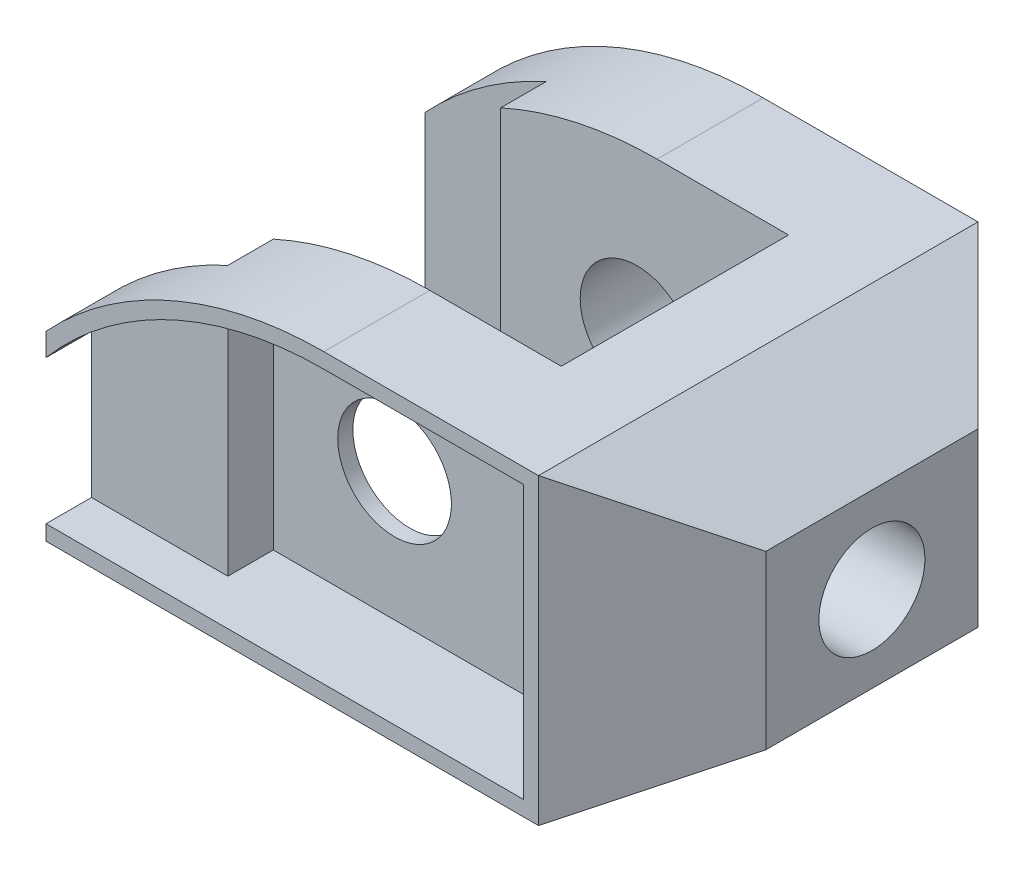
ISO-10303-21;
HEADER;
FILE_DESCRIPTION(('STEP AP214'),'2;1');
FILE_NAME('part.step','',(''),(''),'','','');
FILE_SCHEMA(('AUTOMOTIVE_DESIGN { 1 0 10303 214 1 1 1 1 }'));
ENDSEC;
DATA;
#1=APPLICATION_CONTEXT('core data for automotive mechanical design processes');
#2=APPLICATION_PROTOCOL_DEFINITION('international standard','automotive_design',2000,#1);
#3=PRODUCT_CONTEXT('',#1,'mechanical');
#4=PRODUCT('Part','Part','',(#3));
#5=PRODUCT_RELATED_PRODUCT_CATEGORY('part','',(#4));
#6=PRODUCT_DEFINITION_FORMATION('','',#4);
#7=PRODUCT_DEFINITION_CONTEXT('part definition',#1,'design');
#8=PRODUCT_DEFINITION('design','',#6,#7);
#9=PRODUCT_DEFINITION_SHAPE('','',#8);
#10=(LENGTH_UNIT() NAMED_UNIT(*) SI_UNIT(.MILLI.,.METRE.));
#11=(NAMED_UNIT(*) PLANE_ANGLE_UNIT() SI_UNIT($,.RADIAN.));
#12=(NAMED_UNIT(*) SI_UNIT($,.STERADIAN.) SOLID_ANGLE_UNIT());
#13=UNCERTAINTY_MEASURE_WITH_UNIT(LENGTH_MEASURE(1.E-05),#10,'distance_accuracy_value','');
#14=(GEOMETRIC_REPRESENTATION_CONTEXT(3) GLOBAL_UNCERTAINTY_ASSIGNED_CONTEXT((#13)) GLOBAL_UNIT_ASSIGNED_CONTEXT((#10,
#11,#12)) REPRESENTATION_CONTEXT('',''));
#15=CARTESIAN_POINT('',(0.,0.,0.));
#16=DIRECTION('',(0.,0.,1.));
#17=DIRECTION('',(1.,0.,0.));
#18=AXIS2_PLACEMENT_3D('',#15,#16,#17);
#19=CARTESIAN_POINT('',(34.,19.,29.));
#20=DIRECTION('',(0.,0.,-1.));
#21=DIRECTION('',(-1.,0.,0.));
#22=AXIS2_PLACEMENT_3D('',#19,#20,#21);
#23=CYLINDRICAL_SURFACE('',#22,7.5);
#24=CARTESIAN_POINT('',(34.,19.,15.));
#25=DIRECTION('',(0.,0.,1.));
#26=DIRECTION('',(1.,0.,0.));
#27=AXIS2_PLACEMENT_3D('',#24,#25,#26);
#28=CIRCLE('',#27,7.5);
#29=CARTESIAN_POINT('',(26.5,19.,15.));
#30=VERTEX_POINT('',#29);
#31=EDGE_CURVE('E325',#30,#30,#28,.T.);
#32=CARTESIAN_POINT('',(34.,19.,17.));
#33=DIRECTION('',(0.,0.,1.));
#34=DIRECTION('',(1.,0.,0.));
#35=AXIS2_PLACEMENT_3D('',#32,#33,#34);
#36=CIRCLE('',#35,7.5);
#37=CARTESIAN_POINT('',(26.5,19.,17.));
#38=VERTEX_POINT('',#37);
#39=EDGE_CURVE('E51',#38,#38,#36,.T.);
#40=CARTESIAN_POINT('',(26.5,19.,15.));
#41=CARTESIAN_POINT('',(26.5,19.,15.0208333333333));
#42=CARTESIAN_POINT('',(26.5,19.,15.0416666666667));
#43=CARTESIAN_POINT('',(26.5,19.,15.0833333333333));
#44=CARTESIAN_POINT('',(26.5,19.,15.1041666666667));
#45=CARTESIAN_POINT('',(26.5,19.,15.1458333333333));
#46=CARTESIAN_POINT('',(26.5,19.,15.1666666666667));
#47=CARTESIAN_POINT('',(26.5,19.,15.2083333333333));
#48=CARTESIAN_POINT('',(26.5,19.,15.2291666666667));
#49=CARTESIAN_POINT('',(26.5,19.,15.2708333333333));
#50=CARTESIAN_POINT('',(26.5,19.,15.2916666666667));
#51=CARTESIAN_POINT('',(26.5,19.,15.3333333333333));
#52=CARTESIAN_POINT('',(26.5,19.,15.3541666666667));
#53=CARTESIAN_POINT('',(26.5,19.,15.3958333333333));
#54=CARTESIAN_POINT('',(26.5,19.,15.4166666666667));
#55=CARTESIAN_POINT('',(26.5,19.,15.4583333333333));
#56=CARTESIAN_POINT('',(26.5,19.,15.4791666666667));
#57=CARTESIAN_POINT('',(26.5,19.,15.5208333333333));
#58=CARTESIAN_POINT('',(26.5,19.,15.5416666666667));
#59=CARTESIAN_POINT('',(26.5,19.,15.5833333333333));
#60=CARTESIAN_POINT('',(26.5,19.,15.6041666666667));
#61=CARTESIAN_POINT('',(26.5,19.,15.6458333333333));
#62=CARTESIAN_POINT('',(26.5,19.,15.6666666666667));
#63=CARTESIAN_POINT('',(26.5,19.,15.7083333333333));
#64=CARTESIAN_POINT('',(26.5,19.,15.7291666666667));
#65=CARTESIAN_POINT('',(26.5,19.,15.7708333333333));
#66=CARTESIAN_POINT('',(26.5,19.,15.7916666666667));
#67=CARTESIAN_POINT('',(26.5,19.,15.8333333333333));
#68=CARTESIAN_POINT('',(26.5,19.,15.8541666666667));
#69=CARTESIAN_POINT('',(26.5,19.,15.8958333333333));
#70=CARTESIAN_POINT('',(26.5,19.,15.9166666666667));
#71=CARTESIAN_POINT('',(26.5,19.,15.9583333333333));
#72=CARTESIAN_POINT('',(26.5,19.,15.9791666666667));
#73=CARTESIAN_POINT('',(26.5,19.,16.0208333333333));
#74=CARTESIAN_POINT('',(26.5,19.,16.0416666666667));
#75=CARTESIAN_POINT('',(26.5,19.,16.0833333333333));
#76=CARTESIAN_POINT('',(26.5,19.,16.1041666666667));
#77=CARTESIAN_POINT('',(26.5,19.,16.1458333333333));
#78=CARTESIAN_POINT('',(26.5,19.,16.1666666666667));
#79=CARTESIAN_POINT('',(26.5,19.,16.2083333333333));
#80=CARTESIAN_POINT('',(26.5,19.,16.2291666666667));
#81=CARTESIAN_POINT('',(26.5,19.,16.2708333333333));
#82=CARTESIAN_POINT('',(26.5,19.,16.2916666666667));
#83=CARTESIAN_POINT('',(26.5,19.,16.3333333333333));
#84=CARTESIAN_POINT('',(26.5,19.,16.3541666666667));
#85=CARTESIAN_POINT('',(26.5,19.,16.3958333333333));
#86=CARTESIAN_POINT('',(26.5,19.,16.4166666666667));
#87=CARTESIAN_POINT('',(26.5,19.,16.4583333333333));
#88=CARTESIAN_POINT('',(26.5,19.,16.4791666666667));
#89=CARTESIAN_POINT('',(26.5,19.,16.5208333333333));
#90=CARTESIAN_POINT('',(26.5,19.,16.5416666666667));
#91=CARTESIAN_POINT('',(26.5,19.,16.5833333333333));
#92=CARTESIAN_POINT('',(26.5,19.,16.6041666666667));
#93=CARTESIAN_POINT('',(26.5,19.,16.6458333333333));
#94=CARTESIAN_POINT('',(26.5,19.,16.6666666666667));
#95=CARTESIAN_POINT('',(26.5,19.,16.7083333333333));
#96=CARTESIAN_POINT('',(26.5,19.,16.7291666666667));
#97=CARTESIAN_POINT('',(26.5,19.,16.7708333333333));
#98=CARTESIAN_POINT('',(26.5,19.,16.7916666666667));
#99=CARTESIAN_POINT('',(26.5,19.,16.8333333333333));
#100=CARTESIAN_POINT('',(26.5,19.,16.8541666666667));
#101=CARTESIAN_POINT('',(26.5,19.,16.8958333333333));
#102=CARTESIAN_POINT('',(26.5,19.,16.9166666666667));
#103=CARTESIAN_POINT('',(26.5,19.,16.9583333333333));
#104=CARTESIAN_POINT('',(26.5,19.,16.9791666666667));
#105=CARTESIAN_POINT('',(26.5,19.,17.));
#106=B_SPLINE_CURVE_WITH_KNOTS('',3,(#40,#41,#42,#43,#44,#45,#46,#47,#48,#49,#50,#51,#52,#53,
#54,#55,#56,#57,#58,#59,#60,#61,#62,#63,#64,#65,#66,#67,#68,#69,#70,#71,#72,#73,#74,#75,#76,#77,
#78,#79,#80,#81,#82,#83,#84,#85,#86,#87,#88,#89,#90,#91,#92,#93,#94,#95,#96,#97,#98,#99,#100,
#101,#102,#103,#104,#105),.UNSPECIFIED.,.F.,.F.,(4,2,2,2,2,2,2,2,2,2,2,2,2,2,2,2,2,2,2,2,2,2,2,
2,2,2,2,2,2,2,2,2,4),(0.,0.0625000000000001,0.125,0.1875,0.25,0.3125,0.375,0.4375,0.5,
0.562499999999999,0.624999999999999,0.687499999999999,0.749999999999999,0.812499999999999,
0.874999999999999,0.937499999999999,0.999999999999999,1.0625,1.125,1.1875,1.25,1.3125,1.375,
1.4375,1.5,1.5625,1.625,1.6875,1.75,1.8125,1.875,1.9375,2.),.UNSPECIFIED.);
#107=EDGE_CURVE('BSEAM47',#30,#38,#106,.T.);
#108=ORIENTED_EDGE('',*,*,#31,.F.);
#109=ORIENTED_EDGE('',*,*,#39,.T.);
#110=ORIENTED_EDGE('',*,*,#107,.T.);
#111=ORIENTED_EDGE('',*,*,#107,.F.);
#112=EDGE_LOOP('',(#108,#110,#109,#111));
#113=FACE_BOUND('',#112,.T.);
#114=ADVANCED_FACE('F47',(#113),#23,.F.);
#115=CARTESIAN_POINT('',(36.6606055596467,-10.,29.));
#116=DIRECTION('',(0.,0.,-1.));
#117=DIRECTION('',(-1.,0.,0.));
#118=AXIS2_PLACEMENT_3D('',#115,#116,#117);
#119=PLANE('',#118);
#120=DIRECTION('',(0.,1.,0.));
#121=VECTOR('',#120,1.);
#122=CARTESIAN_POINT('',(63.,2.,29.));
#123=LINE('',#122,#121);
#124=CARTESIAN_POINT('',(63.,2.,29.));
#125=VERTEX_POINT('',#124);
#126=CARTESIAN_POINT('',(63.,38.,29.));
#127=VERTEX_POINT('',#126);
#128=EDGE_CURVE('E213',#125,#127,#123,.T.);
#129=ORIENTED_EDGE('',*,*,#128,.F.);
#130=DIRECTION('',(1.,0.,0.));
#131=VECTOR('',#130,1.);
#132=CARTESIAN_POINT('',(0.,2.,29.));
#133=LINE('',#132,#131);
#134=CARTESIAN_POINT('',(0.,2.,29.));
#135=VERTEX_POINT('',#134);
#136=EDGE_CURVE('E264',#135,#125,#133,.T.);
#137=ORIENTED_EDGE('',*,*,#136,.F.);
#138=DIRECTION('',(0.,-1.,0.));
#139=VECTOR('',#138,1.);
#140=CARTESIAN_POINT('',(0.,0.,29.));
#141=LINE('',#140,#139);
#142=CARTESIAN_POINT('',(0.,0.,29.));
#143=VERTEX_POINT('',#142);
#144=EDGE_CURVE('E404',#135,#143,#141,.T.);
#145=ORIENTED_EDGE('',*,*,#144,.T.);
#146=DIRECTION('',(1.,0.,0.));
#147=VECTOR('',#146,1.);
#148=CARTESIAN_POINT('',(0.,0.,29.));
#149=LINE('',#148,#147);
#150=CARTESIAN_POINT('',(65.,0.,29.));
#151=VERTEX_POINT('',#150);
#152=EDGE_CURVE('E393',#143,#151,#149,.T.);
#153=ORIENTED_EDGE('',*,*,#152,.T.);
#154=DIRECTION('',(0.,-1.,0.));
#155=VECTOR('',#154,1.);
#156=CARTESIAN_POINT('',(65.,58.,29.));
#157=LINE('',#156,#155);
#158=CARTESIAN_POINT('',(65.,40.,29.));
#159=VERTEX_POINT('',#158);
#160=EDGE_CURVE('E299',#159,#151,#157,.T.);
#161=ORIENTED_EDGE('',*,*,#160,.F.);
#162=DIRECTION('',(-1.,0.,0.));
#163=VECTOR('',#162,1.);
#164=CARTESIAN_POINT('',(65.,40.,29.));
#165=LINE('',#164,#163);
#166=CARTESIAN_POINT('',(36.6606055596467,40.,29.));
#167=VERTEX_POINT('',#166);
#168=EDGE_CURVE('E397',#159,#167,#165,.T.);
#169=ORIENTED_EDGE('',*,*,#168,.T.);
#170=CARTESIAN_POINT('',(36.6606055596467,-10.,29.));
#171=DIRECTION('',(0.,0.,1.));
#172=DIRECTION('',(-1.,0.,0.));
#173=AXIS2_PLACEMENT_3D('',#170,#171,#172);
#174=CIRCLE('',#173,50.);
#175=CARTESIAN_POINT('',(0.,24.,29.));
#176=VERTEX_POINT('',#175);
#177=EDGE_CURVE('E401',#167,#176,#174,.T.);
#178=ORIENTED_EDGE('',*,*,#177,.T.);
#179=CARTESIAN_POINT('',(0.,20.9838667696594,29.));
#180=VERTEX_POINT('',#179);
#181=EDGE_CURVE('E405',#176,#180,#141,.T.);
#182=ORIENTED_EDGE('',*,*,#181,.T.);
#183=CARTESIAN_POINT('',(36.6606055596467,-10.,29.));
#184=DIRECTION('',(0.,0.,1.));
#185=DIRECTION('',(1.,0.,0.));
#186=AXIS2_PLACEMENT_3D('',#183,#184,#185);
#187=CIRCLE('',#186,48.);
#188=CARTESIAN_POINT('',(36.6606055596467,38.,29.));
#189=VERTEX_POINT('',#188);
#190=EDGE_CURVE('E258',#189,#180,#187,.T.);
#191=ORIENTED_EDGE('',*,*,#190,.F.);
#192=DIRECTION('',(-1.,0.,0.));
#193=VECTOR('',#192,1.);
#194=CARTESIAN_POINT('',(63.,38.,29.));
#195=LINE('',#194,#193);
#196=EDGE_CURVE('E270',#127,#189,#195,.T.);
#197=ORIENTED_EDGE('',*,*,#196,.F.);
#198=EDGE_LOOP('',(#129,#137,#145,#153,#161,#169,#178,#182,#191,#197));
#199=FACE_BOUND('',#198,.T.);
#200=ADVANCED_FACE('F503',(#199),#119,.F.);
#201=CARTESIAN_POINT('',(36.6606055596467,-10.,-29.));
#202=DIRECTION('',(0.,0.,-1.));
#203=DIRECTION('',(-1.,0.,0.));
#204=AXIS2_PLACEMENT_3D('',#201,#202,#203);
#205=PLANE('',#204);
#206=CARTESIAN_POINT('',(34.,19.,-29.));
#207=DIRECTION('',(0.,0.,1.));
#208=DIRECTION('',(1.,0.,0.));
#209=AXIS2_PLACEMENT_3D('',#206,#207,#208);
#210=CIRCLE('',#209,7.5);
#211=CARTESIAN_POINT('',(26.5,19.,-29.));
#212=VERTEX_POINT('',#211);
#213=EDGE_CURVE('E388',#212,#212,#210,.T.);
#214=ORIENTED_EDGE('',*,*,#213,.T.);
#215=EDGE_LOOP('',(#214));
#216=FACE_BOUND('',#215,.T.);
#217=DIRECTION('',(-1.,0.,0.));
#218=VECTOR('',#217,1.);
#219=CARTESIAN_POINT('',(65.,40.,-29.));
#220=LINE('',#219,#218);
#221=CARTESIAN_POINT('',(65.,40.,-29.));
#222=VERTEX_POINT('',#221);
#223=CARTESIAN_POINT('',(36.6606055596467,40.,-29.));
#224=VERTEX_POINT('',#223);
#225=EDGE_CURVE('E413',#222,#224,#220,.T.);
#226=ORIENTED_EDGE('',*,*,#225,.F.);
#227=DIRECTION('',(0.,-1.,0.));
#228=VECTOR('',#227,1.);
#229=CARTESIAN_POINT('',(65.,58.,-29.));
#230=LINE('',#229,#228);
#231=CARTESIAN_POINT('',(65.,0.,-29.));
#232=VERTEX_POINT('',#231);
#233=EDGE_CURVE('E291',#222,#232,#230,.T.);
#234=ORIENTED_EDGE('',*,*,#233,.T.);
#235=DIRECTION('',(1.,0.,0.));
#236=VECTOR('',#235,1.);
#237=CARTESIAN_POINT('',(0.,0.,-29.));
#238=LINE('',#237,#236);
#239=CARTESIAN_POINT('',(0.,0.,-29.));
#240=VERTEX_POINT('',#239);
#241=EDGE_CURVE('E392',#240,#232,#238,.T.);
#242=ORIENTED_EDGE('',*,*,#241,.F.);
#243=DIRECTION('',(0.,-1.,0.));
#244=VECTOR('',#243,1.);
#245=CARTESIAN_POINT('',(0.,0.,-29.));
#246=LINE('',#245,#244);
#247=CARTESIAN_POINT('',(0.,24.,-29.));
#248=VERTEX_POINT('',#247);
#249=EDGE_CURVE('E398',#248,#240,#246,.T.);
#250=ORIENTED_EDGE('',*,*,#249,.F.);
#251=CARTESIAN_POINT('',(36.6606055596467,-10.,-29.));
#252=DIRECTION('',(0.,0.,1.));
#253=DIRECTION('',(-1.,0.,0.));
#254=AXIS2_PLACEMENT_3D('',#251,#252,#253);
#255=CIRCLE('',#254,50.);
#256=EDGE_CURVE('E417',#224,#248,#255,.T.);
#257=ORIENTED_EDGE('',*,*,#256,.F.);
#258=EDGE_LOOP('',(#226,#234,#242,#250,#257));
#259=FACE_BOUND('',#258,.T.);
#260=ADVANCED_FACE('F510',(#216,#259),#205,.T.);
#261=CARTESIAN_POINT('',(65.,0.,29.));
#262=DIRECTION('',(-0.500000000000001,0.866025403784438,0.));
#263=DIRECTION('',(-0.866025403784438,-0.500000000000001,0.));
#264=AXIS2_PLACEMENT_3D('',#261,#262,#263);
#265=PLANE('',#264);
#266=DIRECTION('',(-0.654653670707976,-0.377964473009228,-0.654653670707978));
#267=VECTOR('',#266,1.);
#268=CARTESIAN_POINT('',(89.8571428571429,14.3512781198565,-4.1428571428571));
#269=LINE('',#268,#267);
#270=CARTESIAN_POINT('',(80.,8.66025403784443,-14.));
#271=VERTEX_POINT('',#270);
#272=EDGE_CURVE('E306',#271,#232,#269,.T.);
#273=ORIENTED_EDGE('',*,*,#272,.F.);
#274=DIRECTION('',(0.,0.,-1.));
#275=VECTOR('',#274,1.);
#276=CARTESIAN_POINT('',(80.,8.66025403784441,29.));
#277=LINE('',#276,#275);
#278=CARTESIAN_POINT('',(80.,8.66025403784443,14.));
#279=VERTEX_POINT('',#278);
#280=EDGE_CURVE('E446',#279,#271,#277,.T.);
#281=ORIENTED_EDGE('',*,*,#280,.F.);
#282=DIRECTION('',(0.654653670707976,0.377964473009228,-0.654653670707978));
#283=VECTOR('',#282,1.);
#284=CARTESIAN_POINT('',(65.,0.,29.));
#285=LINE('',#284,#283);
#286=EDGE_CURVE('E298',#151,#279,#285,.T.);
#287=ORIENTED_EDGE('',*,*,#286,.F.);
#288=DIRECTION('',(0.,0.,-1.));
#289=VECTOR('',#288,1.);
#290=CARTESIAN_POINT('',(65.,0.,29.));
#291=LINE('',#290,#289);
#292=EDGE_CURVE('E450',#151,#232,#291,.T.);
#293=ORIENTED_EDGE('',*,*,#292,.T.);
#294=EDGE_LOOP('',(#273,#281,#287,#293));
#295=FACE_BOUND('',#294,.T.);
#296=ADVANCED_FACE('F536',(#295),#265,.F.);
#297=CARTESIAN_POINT('',(80.,8.66025403784441,29.));
#298=DIRECTION('',(-1.,0.,0.));
#299=DIRECTION('',(0.,0.,1.));
#300=AXIS2_PLACEMENT_3D('',#297,#298,#299);
#301=PLANE('',#300);
#302=CARTESIAN_POINT('',(80.,20.,0.));
#303=DIRECTION('',(1.,0.,0.));
#304=DIRECTION('',(0.,0.,-1.));
#305=AXIS2_PLACEMENT_3D('',#302,#303,#304);
#306=CIRCLE('',#305,7.);
#307=CARTESIAN_POINT('',(80.,20.,-7.));
#308=VERTEX_POINT('',#307);
#309=EDGE_CURVE('E278',#308,#308,#306,.T.);
#310=ORIENTED_EDGE('',*,*,#309,.F.);
#311=EDGE_LOOP('',(#310));
#312=FACE_BOUND('',#311,.T.);
#313=DIRECTION('',(0.,-1.,0.));
#314=VECTOR('',#313,1.);
#315=CARTESIAN_POINT('',(80.,58.,-14.));
#316=LINE('',#315,#314);
#317=CARTESIAN_POINT('',(80.,31.3397459621556,-14.));
#318=VERTEX_POINT('',#317);
#319=EDGE_CURVE('E295',#318,#271,#316,.T.);
#320=ORIENTED_EDGE('',*,*,#319,.F.);
#321=DIRECTION('',(0.,0.,-1.));
#322=VECTOR('',#321,1.);
#323=CARTESIAN_POINT('',(80.,31.3397459621556,29.));
#324=LINE('',#323,#322);
#325=CARTESIAN_POINT('',(80.,31.3397459621556,14.));
#326=VERTEX_POINT('',#325);
#327=EDGE_CURVE('E442',#326,#318,#324,.T.);
#328=ORIENTED_EDGE('',*,*,#327,.F.);
#329=DIRECTION('',(0.,-1.,0.));
#330=VECTOR('',#329,1.);
#331=CARTESIAN_POINT('',(80.,58.,14.));
#332=LINE('',#331,#330);
#333=EDGE_CURVE('E73',#326,#279,#332,.T.);
#334=ORIENTED_EDGE('',*,*,#333,.T.);
#335=ORIENTED_EDGE('',*,*,#280,.T.);
#336=EDGE_LOOP('',(#320,#328,#334,#335));
#337=FACE_BOUND('',#336,.T.);
#338=ADVANCED_FACE('F555',(#312,#337),#301,.F.);
#339=CARTESIAN_POINT('',(80.,31.3397459621556,29.));
#340=DIRECTION('',(-0.500000000000001,-0.866025403784438,0.));
#341=DIRECTION('',(0.866025403784438,-0.500000000000001,0.));
#342=AXIS2_PLACEMENT_3D('',#339,#340,#341);
#343=PLANE('',#342);
#344=DIRECTION('',(0.654653670707976,-0.377964473009228,0.654653670707978));
#345=VECTOR('',#344,1.);
#346=CARTESIAN_POINT('',(98.4285714285714,20.7000052870896,4.42857142857149));
#347=LINE('',#346,#345);
#348=EDGE_CURVE('E12',#222,#318,#347,.T.);
#349=ORIENTED_EDGE('',*,*,#348,.F.);
#350=DIRECTION('',(0.,0.,-1.));
#351=VECTOR('',#350,1.);
#352=CARTESIAN_POINT('',(65.,40.,29.));
#353=LINE('',#352,#351);
#354=EDGE_CURVE('E438',#159,#222,#353,.T.);
#355=ORIENTED_EDGE('',*,*,#354,.F.);
#356=DIRECTION('',(-0.654653670707976,0.377964473009228,0.654653670707978));
#357=VECTOR('',#356,1.);
#358=CARTESIAN_POINT('',(73.5714285714286,35.0512834069461,20.4285714285714));
#359=LINE('',#358,#357);
#360=EDGE_CURVE('E57',#326,#159,#359,.T.);
#361=ORIENTED_EDGE('',*,*,#360,.F.);
#362=ORIENTED_EDGE('',*,*,#327,.T.);
#363=EDGE_LOOP('',(#349,#355,#361,#362));
#364=FACE_BOUND('',#363,.T.);
#365=ADVANCED_FACE('F550',(#364),#343,.F.);
#366=CARTESIAN_POINT('',(36.6606055596467,-10.,29.));
#367=DIRECTION('',(0.,0.,-1.));
#368=DIRECTION('',(-1.,0.,0.));
#369=AXIS2_PLACEMENT_3D('',#366,#367,#368);
#370=CYLINDRICAL_SURFACE('',#369,50.);
#371=DIRECTION('',(0.,0.,-1.));
#372=VECTOR('',#371,1.);
#373=CARTESIAN_POINT('',(0.,24.,29.));
#374=LINE('',#373,#372);
#375=CARTESIAN_POINT('',(0.,24.,-21.));
#376=VERTEX_POINT('',#375);
#377=EDGE_CURVE('E428',#376,#248,#374,.T.);
#378=ORIENTED_EDGE('',*,*,#377,.F.);
#379=CARTESIAN_POINT('',(36.6606055596467,-10.,-21.));
#380=DIRECTION('',(0.,0.,-1.));
#381=DIRECTION('',(-1.,0.,0.));
#382=AXIS2_PLACEMENT_3D('',#379,#380,#381);
#383=CIRCLE('',#382,50.);
#384=CARTESIAN_POINT('',(16.,35.5317403347236,-21.));
#385=VERTEX_POINT('',#384);
#386=EDGE_CURVE('E368',#376,#385,#383,.T.);
#387=ORIENTED_EDGE('',*,*,#386,.T.);
#388=DIRECTION('',(0.,0.,-1.));
#389=VECTOR('',#388,1.);
#390=CARTESIAN_POINT('',(16.,35.5317403347236,29.));
#391=LINE('',#390,#389);
#392=CARTESIAN_POINT('',(16.,35.5317403347236,-15.));
#393=VERTEX_POINT('',#392);
#394=EDGE_CURVE('E472',#385,#393,#391,.F.);
#395=ORIENTED_EDGE('',*,*,#394,.T.);
#396=CARTESIAN_POINT('',(36.6606055596467,-10.,-15.));
#397=DIRECTION('',(0.,0.,-1.));
#398=DIRECTION('',(-1.,0.,0.));
#399=AXIS2_PLACEMENT_3D('',#396,#397,#398);
#400=CIRCLE('',#399,50.);
#401=CARTESIAN_POINT('',(36.6606055596467,40.,-15.));
#402=VERTEX_POINT('',#401);
#403=EDGE_CURVE('E352',#393,#402,#400,.T.);
#404=ORIENTED_EDGE('',*,*,#403,.T.);
#405=DIRECTION('',(0.,0.,-1.));
#406=VECTOR('',#405,1.);
#407=CARTESIAN_POINT('',(36.6606055596467,40.,29.));
#408=LINE('',#407,#406);
#409=EDGE_CURVE('E433',#402,#224,#408,.T.);
#410=ORIENTED_EDGE('',*,*,#409,.T.);
#411=ORIENTED_EDGE('',*,*,#256,.T.);
#412=EDGE_LOOP('',(#378,#387,#395,#404,#410,#411));
#413=FACE_BOUND('',#412,.T.);
#414=ADVANCED_FACE('F526',(#413),#370,.T.);
#415=CARTESIAN_POINT('',(0.,0.,29.));
#416=DIRECTION('',(1.,0.,0.));
#417=DIRECTION('',(0.,0.,-1.));
#418=AXIS2_PLACEMENT_3D('',#415,#416,#417);
#419=PLANE('',#418);
#420=DIRECTION('',(0.,0.,-1.));
#421=VECTOR('',#420,1.);
#422=CARTESIAN_POINT('',(0.,0.,29.));
#423=LINE('',#422,#421);
#424=CARTESIAN_POINT('',(0.,0.,-21.));
#425=VERTEX_POINT('',#424);
#426=EDGE_CURVE('E409',#425,#240,#423,.T.);
#427=ORIENTED_EDGE('',*,*,#426,.F.);
#428=DIRECTION('',(0.,1.,0.));
#429=VECTOR('',#428,1.);
#430=CARTESIAN_POINT('',(0.,0.,-21.));
#431=LINE('',#430,#429);
#432=EDGE_CURVE('E464',#425,#376,#431,.T.);
#433=ORIENTED_EDGE('',*,*,#432,.T.);
#434=ORIENTED_EDGE('',*,*,#377,.T.);
#435=ORIENTED_EDGE('',*,*,#249,.T.);
#436=EDGE_LOOP('',(#427,#433,#434,#435));
#437=FACE_BOUND('',#436,.T.);
#438=ADVANCED_FACE('F517',(#437),#419,.F.);
#439=CARTESIAN_POINT('',(34.,19.,-15.));
#440=DIRECTION('',(0.,0.,-1.));
#441=DIRECTION('',(-1.,0.,0.));
#442=AXIS2_PLACEMENT_3D('',#439,#440,#441);
#443=CIRCLE('',#442,7.5);
#444=CARTESIAN_POINT('',(26.5,19.,-15.));
#445=VERTEX_POINT('',#444);
#446=EDGE_CURVE('E351',#445,#445,#443,.T.);
#447=CARTESIAN_POINT('',(26.5,19.,-15.));
#448=CARTESIAN_POINT('',(26.5,19.,-15.1458333333333));
#449=CARTESIAN_POINT('',(26.5,19.,-15.2916666666667));
#450=CARTESIAN_POINT('',(26.5,19.,-15.5833333333333));
#451=CARTESIAN_POINT('',(26.5,19.,-15.7291666666667));
#452=CARTESIAN_POINT('',(26.5,19.,-16.0208333333333));
#453=CARTESIAN_POINT('',(26.5,19.,-16.1666666666667));
#454=CARTESIAN_POINT('',(26.5,19.,-16.4583333333333));
#455=CARTESIAN_POINT('',(26.5,19.,-16.6041666666667));
#456=CARTESIAN_POINT('',(26.5,19.,-16.8958333333333));
#457=CARTESIAN_POINT('',(26.5,19.,-17.0416666666667));
#458=CARTESIAN_POINT('',(26.5,19.,-17.3333333333333));
#459=CARTESIAN_POINT('',(26.5,19.,-17.4791666666667));
#460=CARTESIAN_POINT('',(26.5,19.,-17.7708333333333));
#461=CARTESIAN_POINT('',(26.5,19.,-17.9166666666667));
#462=CARTESIAN_POINT('',(26.5,19.,-18.2083333333333));
#463=CARTESIAN_POINT('',(26.5,19.,-18.3541666666667));
#464=CARTESIAN_POINT('',(26.5,19.,-18.6458333333333));
#465=CARTESIAN_POINT('',(26.5,19.,-18.7916666666667));
#466=CARTESIAN_POINT('',(26.5,19.,-19.0833333333333));
#467=CARTESIAN_POINT('',(26.5,19.,-19.2291666666667));
#468=CARTESIAN_POINT('',(26.5,19.,-19.5208333333333));
#469=CARTESIAN_POINT('',(26.5,19.,-19.6666666666667));
#470=CARTESIAN_POINT('',(26.5,19.,-19.9583333333333));
#471=CARTESIAN_POINT('',(26.5,19.,-20.1041666666667));
#472=CARTESIAN_POINT('',(26.5,19.,-20.3958333333333));
#473=CARTESIAN_POINT('',(26.5,19.,-20.5416666666667));
#474=CARTESIAN_POINT('',(26.5,19.,-20.8333333333333));
#475=CARTESIAN_POINT('',(26.5,19.,-20.9791666666667));
#476=CARTESIAN_POINT('',(26.5,19.,-21.2708333333333));
#477=CARTESIAN_POINT('',(26.5,19.,-21.4166666666667));
#478=CARTESIAN_POINT('',(26.5,19.,-21.7083333333333));
#479=CARTESIAN_POINT('',(26.5,19.,-21.8541666666667));
#480=CARTESIAN_POINT('',(26.5,19.,-22.1458333333333));
#481=CARTESIAN_POINT('',(26.5,19.,-22.2916666666667));
#482=CARTESIAN_POINT('',(26.5,19.,-22.5833333333333));
#483=CARTESIAN_POINT('',(26.5,19.,-22.7291666666667));
#484=CARTESIAN_POINT('',(26.5,19.,-23.0208333333333));
#485=CARTESIAN_POINT('',(26.5,19.,-23.1666666666667));
#486=CARTESIAN_POINT('',(26.5,19.,-23.4583333333333));
#487=CARTESIAN_POINT('',(26.5,19.,-23.6041666666667));
#488=CARTESIAN_POINT('',(26.5,19.,-23.8958333333333));
#489=CARTESIAN_POINT('',(26.5,19.,-24.0416666666667));
#490=CARTESIAN_POINT('',(26.5,19.,-24.3333333333333));
#491=CARTESIAN_POINT('',(26.5,19.,-24.4791666666667));
#492=CARTESIAN_POINT('',(26.5,19.,-24.7708333333333));
#493=CARTESIAN_POINT('',(26.5,19.,-24.9166666666667));
#494=CARTESIAN_POINT('',(26.5,19.,-25.2083333333333));
#495=CARTESIAN_POINT('',(26.5,19.,-25.3541666666667));
#496=CARTESIAN_POINT('',(26.5,19.,-25.6458333333333));
#497=CARTESIAN_POINT('',(26.5,19.,-25.7916666666667));
#498=CARTESIAN_POINT('',(26.5,19.,-26.0833333333333));
#499=CARTESIAN_POINT('',(26.5,19.,-26.2291666666667));
#500=CARTESIAN_POINT('',(26.5,19.,-26.5208333333333));
#501=CARTESIAN_POINT('',(26.5,19.,-26.6666666666667));
#502=CARTESIAN_POINT('',(26.5,19.,-26.9583333333333));
#503=CARTESIAN_POINT('',(26.5,19.,-27.1041666666667));
#504=CARTESIAN_POINT('',(26.5,19.,-27.3958333333333));
#505=CARTESIAN_POINT('',(26.5,19.,-27.5416666666667));
#506=CARTESIAN_POINT('',(26.5,19.,-27.8333333333333));
#507=CARTESIAN_POINT('',(26.5,19.,-27.9791666666667));
#508=CARTESIAN_POINT('',(26.5,19.,-28.2708333333333));
#509=CARTESIAN_POINT('',(26.5,19.,-28.4166666666667));
#510=CARTESIAN_POINT('',(26.5,19.,-28.7083333333333));
#511=CARTESIAN_POINT('',(26.5,19.,-28.8541666666667));
#512=CARTESIAN_POINT('',(26.5,19.,-29.));
#513=B_SPLINE_CURVE_WITH_KNOTS('',3,(#447,#448,#449,#450,#451,#452,#453,#454,#455,#456,#457,
#458,#459,#460,#461,#462,#463,#464,#465,#466,#467,#468,#469,#470,#471,#472,#473,#474,#475,#476,
#477,#478,#479,#480,#481,#482,#483,#484,#485,#486,#487,#488,#489,#490,#491,#492,#493,#494,#495,
#496,#497,#498,#499,#500,#501,#502,#503,#504,#505,#506,#507,#508,#509,#510,#511,#512),
.UNSPECIFIED.,.F.,.F.,(4,2,2,2,2,2,2,2,2,2,2,2,2,2,2,2,2,2,2,2,2,2,2,2,2,2,2,2,2,2,2,2,4),(0.,
0.4375,0.875000000000001,1.3125,1.75,2.1875,2.625,3.0625,3.5,3.9375,4.375,4.8125,5.25,
5.68750000000001,6.12500000000001,6.56250000000001,7.00000000000001,7.43750000000001,
7.87500000000001,8.31250000000001,8.75000000000001,9.18750000000001,9.62500000000001,10.0625,
10.5,10.9375,11.375,11.8125,12.25,12.6875,13.125,13.5625,14.),.UNSPECIFIED.);
#514=EDGE_CURVE('BSEAM506',#445,#212,#513,.T.);
#515=ORIENTED_EDGE('',*,*,#446,.F.);
#516=ORIENTED_EDGE('',*,*,#213,.F.);
#517=ORIENTED_EDGE('',*,*,#514,.T.);
#518=ORIENTED_EDGE('',*,*,#514,.F.);
#519=EDGE_LOOP('',(#515,#517,#516,#518));
#520=FACE_BOUND('',#519,.T.);
#521=ADVANCED_FACE('F506',(#520),#23,.F.);
#522=CARTESIAN_POINT('',(0.,0.,29.));
#523=DIRECTION('',(0.,1.,0.));
#524=DIRECTION('',(0.,0.,1.));
#525=AXIS2_PLACEMENT_3D('',#522,#523,#524);
#526=PLANE('',#525);
#527=DIRECTION('',(0.,0.,-1.));
#528=VECTOR('',#527,1.);
#529=CARTESIAN_POINT('',(16.,0.,29.));
#530=LINE('',#529,#528);
#531=CARTESIAN_POINT('',(16.,0.,-15.));
#532=VERTEX_POINT('',#531);
#533=CARTESIAN_POINT('',(16.,0.,-21.));
#534=VERTEX_POINT('',#533);
#535=EDGE_CURVE('E380',#532,#534,#530,.T.);
#536=ORIENTED_EDGE('',*,*,#535,.T.);
#537=DIRECTION('',(-1.,0.,0.));
#538=VECTOR('',#537,1.);
#539=CARTESIAN_POINT('',(0.,0.,-21.));
#540=LINE('',#539,#538);
#541=EDGE_CURVE('E372',#534,#425,#540,.T.);
#542=ORIENTED_EDGE('',*,*,#541,.T.);
#543=ORIENTED_EDGE('',*,*,#426,.T.);
#544=ORIENTED_EDGE('',*,*,#241,.T.);
#545=ORIENTED_EDGE('',*,*,#292,.F.);
#546=ORIENTED_EDGE('',*,*,#152,.F.);
#547=CARTESIAN_POINT('',(0.,0.,21.));
#548=VERTEX_POINT('',#547);
#549=EDGE_CURVE('E424',#143,#548,#423,.T.);
#550=ORIENTED_EDGE('',*,*,#549,.T.);
#551=DIRECTION('',(1.,0.,0.));
#552=VECTOR('',#551,1.);
#553=CARTESIAN_POINT('',(0.,0.,21.));
#554=LINE('',#553,#552);
#555=CARTESIAN_POINT('',(16.,0.,21.));
#556=VERTEX_POINT('',#555);
#557=EDGE_CURVE('E364',#548,#556,#554,.T.);
#558=ORIENTED_EDGE('',*,*,#557,.T.);
#559=DIRECTION('',(0.,0.,-1.));
#560=VECTOR('',#559,1.);
#561=CARTESIAN_POINT('',(16.,0.,29.));
#562=LINE('',#561,#560);
#563=CARTESIAN_POINT('',(16.,0.,15.));
#564=VERTEX_POINT('',#563);
#565=EDGE_CURVE('E376',#556,#564,#562,.T.);
#566=ORIENTED_EDGE('',*,*,#565,.T.);
#567=DIRECTION('',(1.,0.,0.));
#568=VECTOR('',#567,1.);
#569=CARTESIAN_POINT('',(0.,0.,15.));
#570=LINE('',#569,#568);
#571=CARTESIAN_POINT('',(54.,0.,15.));
#572=VERTEX_POINT('',#571);
#573=EDGE_CURVE('E347',#564,#572,#570,.T.);
#574=ORIENTED_EDGE('',*,*,#573,.T.);
#575=DIRECTION('',(0.,0.,-1.));
#576=VECTOR('',#575,1.);
#577=CARTESIAN_POINT('',(54.,0.,29.));
#578=LINE('',#577,#576);
#579=CARTESIAN_POINT('',(54.,0.,-15.));
#580=VERTEX_POINT('',#579);
#581=EDGE_CURVE('E384',#572,#580,#578,.T.);
#582=ORIENTED_EDGE('',*,*,#581,.T.);
#583=DIRECTION('',(-1.,0.,0.));
#584=VECTOR('',#583,1.);
#585=CARTESIAN_POINT('',(0.,0.,-15.));
#586=LINE('',#585,#584);
#587=EDGE_CURVE('E356',#580,#532,#586,.T.);
#588=ORIENTED_EDGE('',*,*,#587,.T.);
#589=EDGE_LOOP('',(#536,#542,#543,#544,#545,#546,#550,#558,#566,#574,#582,#588));
#590=FACE_BOUND('',#589,.T.);
#591=ADVANCED_FACE('F49',(#590),#526,.F.);
#592=CARTESIAN_POINT('',(65.,40.,29.));
#593=DIRECTION('',(0.,-1.,0.));
#594=DIRECTION('',(1.,0.,0.));
#595=AXIS2_PLACEMENT_3D('',#592,#593,#594);
#596=PLANE('',#595);
#597=ORIENTED_EDGE('',*,*,#409,.F.);
#598=DIRECTION('',(-1.,0.,0.));
#599=VECTOR('',#598,1.);
#600=CARTESIAN_POINT('',(54.,40.,-15.));
#601=LINE('',#600,#599);
#602=CARTESIAN_POINT('',(54.,40.,-15.));
#603=VERTEX_POINT('',#602);
#604=EDGE_CURVE('E317',#603,#402,#601,.T.);
#605=ORIENTED_EDGE('',*,*,#604,.F.);
#606=DIRECTION('',(0.,0.,-1.));
#607=VECTOR('',#606,1.);
#608=CARTESIAN_POINT('',(54.,40.,15.));
#609=LINE('',#608,#607);
#610=CARTESIAN_POINT('',(54.,40.,15.));
#611=VERTEX_POINT('',#610);
#612=EDGE_CURVE('E313',#611,#603,#609,.T.);
#613=ORIENTED_EDGE('',*,*,#612,.F.);
#614=DIRECTION('',(1.,0.,0.));
#615=VECTOR('',#614,1.);
#616=CARTESIAN_POINT('',(54.,40.,15.));
#617=LINE('',#616,#615);
#618=CARTESIAN_POINT('',(36.6606055596467,40.,15.));
#619=VERTEX_POINT('',#618);
#620=EDGE_CURVE('E309',#619,#611,#617,.T.);
#621=ORIENTED_EDGE('',*,*,#620,.F.);
#622=EDGE_CURVE('E434',#167,#619,#408,.T.);
#623=ORIENTED_EDGE('',*,*,#622,.F.);
#624=ORIENTED_EDGE('',*,*,#168,.F.);
#625=ORIENTED_EDGE('',*,*,#354,.T.);
#626=ORIENTED_EDGE('',*,*,#225,.T.);
#627=EDGE_LOOP('',(#597,#605,#613,#621,#623,#624,#625,#626));
#628=FACE_BOUND('',#627,.T.);
#629=ADVANCED_FACE('F524',(#628),#596,.F.);
#630=ORIENTED_EDGE('',*,*,#622,.T.);
#631=CARTESIAN_POINT('',(36.6606055596467,-10.,15.));
#632=DIRECTION('',(0.,0.,1.));
#633=DIRECTION('',(1.,0.,0.));
#634=AXIS2_PLACEMENT_3D('',#631,#632,#633);
#635=CIRCLE('',#634,50.);
#636=CARTESIAN_POINT('',(16.,35.5317403347236,15.));
#637=VERTEX_POINT('',#636);
#638=EDGE_CURVE('E343',#619,#637,#635,.T.);
#639=ORIENTED_EDGE('',*,*,#638,.T.);
#640=DIRECTION('',(0.,0.,-1.));
#641=VECTOR('',#640,1.);
#642=CARTESIAN_POINT('',(16.,35.5317403347236,29.));
#643=LINE('',#642,#641);
#644=CARTESIAN_POINT('',(16.,35.5317403347236,21.));
#645=VERTEX_POINT('',#644);
#646=EDGE_CURVE('E468',#637,#645,#643,.F.);
#647=ORIENTED_EDGE('',*,*,#646,.T.);
#648=CARTESIAN_POINT('',(36.6606055596467,-10.,21.));
#649=DIRECTION('',(0.,0.,1.));
#650=DIRECTION('',(1.,0.,0.));
#651=AXIS2_PLACEMENT_3D('',#648,#649,#650);
#652=CIRCLE('',#651,50.);
#653=CARTESIAN_POINT('',(0.,24.,21.));
#654=VERTEX_POINT('',#653);
#655=EDGE_CURVE('E360',#645,#654,#652,.T.);
#656=ORIENTED_EDGE('',*,*,#655,.T.);
#657=EDGE_CURVE('E429',#176,#654,#374,.T.);
#658=ORIENTED_EDGE('',*,*,#657,.F.);
#659=ORIENTED_EDGE('',*,*,#177,.F.);
#660=EDGE_LOOP('',(#630,#639,#647,#656,#658,#659));
#661=FACE_BOUND('',#660,.T.);
#662=ADVANCED_FACE('F581',(#661),#370,.T.);
#663=ORIENTED_EDGE('',*,*,#144,.F.);
#664=DIRECTION('',(0.,0.,1.));
#665=VECTOR('',#664,1.);
#666=CARTESIAN_POINT('',(0.,2.,23.));
#667=LINE('',#666,#665);
#668=CARTESIAN_POINT('',(0.,2.,23.));
#669=VERTEX_POINT('',#668);
#670=EDGE_CURVE('E275',#669,#135,#667,.T.);
#671=ORIENTED_EDGE('',*,*,#670,.F.);
#672=DIRECTION('',(0.,-1.,0.));
#673=VECTOR('',#672,1.);
#674=CARTESIAN_POINT('',(0.,20.9838667696593,23.));
#675=LINE('',#674,#673);
#676=CARTESIAN_POINT('',(0.,20.9838667696594,23.));
#677=VERTEX_POINT('',#676);
#678=EDGE_CURVE('E261',#677,#669,#675,.T.);
#679=ORIENTED_EDGE('',*,*,#678,.F.);
#680=DIRECTION('',(0.,0.,1.));
#681=VECTOR('',#680,1.);
#682=CARTESIAN_POINT('',(0.,20.9838667696594,23.));
#683=LINE('',#682,#681);
#684=EDGE_CURVE('E279',#677,#180,#683,.T.);
#685=ORIENTED_EDGE('',*,*,#684,.T.);
#686=ORIENTED_EDGE('',*,*,#181,.F.);
#687=ORIENTED_EDGE('',*,*,#657,.T.);
#688=DIRECTION('',(0.,-1.,0.));
#689=VECTOR('',#688,1.);
#690=CARTESIAN_POINT('',(0.,0.,21.));
#691=LINE('',#690,#689);
#692=EDGE_CURVE('E454',#654,#548,#691,.T.);
#693=ORIENTED_EDGE('',*,*,#692,.T.);
#694=ORIENTED_EDGE('',*,*,#549,.F.);
#695=EDGE_LOOP('',(#663,#671,#679,#685,#686,#687,#693,#694));
#696=FACE_BOUND('',#695,.T.);
#697=ADVANCED_FACE('F529',(#696),#419,.F.);
#698=CARTESIAN_POINT('',(54.,-18.,15.));
#699=DIRECTION('',(1.,0.,0.));
#700=DIRECTION('',(0.,1.,0.));
#701=AXIS2_PLACEMENT_3D('',#698,#699,#700);
#702=PLANE('',#701);
#703=CARTESIAN_POINT('',(54.,20.,0.));
#704=DIRECTION('',(1.,0.,0.));
#705=DIRECTION('',(0.,1.,0.));
#706=AXIS2_PLACEMENT_3D('',#703,#704,#705);
#707=CIRCLE('',#706,7.);
#708=CARTESIAN_POINT('',(54.,20.,-7.));
#709=VERTEX_POINT('',#708);
#710=EDGE_CURVE('E290',#709,#709,#707,.T.);
#711=ORIENTED_EDGE('',*,*,#710,.T.);
#712=EDGE_LOOP('',(#711));
#713=FACE_BOUND('',#712,.T.);
#714=DIRECTION('',(0.,1.,0.));
#715=VECTOR('',#714,1.);
#716=CARTESIAN_POINT('',(54.,-18.,15.));
#717=LINE('',#716,#715);
#718=EDGE_CURVE('E333',#572,#611,#717,.T.);
#719=ORIENTED_EDGE('',*,*,#718,.T.);
#720=ORIENTED_EDGE('',*,*,#612,.T.);
#721=DIRECTION('',(0.,1.,0.));
#722=VECTOR('',#721,1.);
#723=CARTESIAN_POINT('',(54.,-18.,-15.));
#724=LINE('',#723,#722);
#725=EDGE_CURVE('E330',#580,#603,#724,.T.);
#726=ORIENTED_EDGE('',*,*,#725,.F.);
#727=ORIENTED_EDGE('',*,*,#581,.F.);
#728=EDGE_LOOP('',(#719,#720,#726,#727));
#729=FACE_BOUND('',#728,.T.);
#730=ADVANCED_FACE('F481',(#713,#729),#702,.F.);
#731=CARTESIAN_POINT('',(16.,-18.,-21.));
#732=DIRECTION('',(1.,0.,0.));
#733=DIRECTION('',(0.,0.,-1.));
#734=AXIS2_PLACEMENT_3D('',#731,#732,#733);
#735=PLANE('',#734);
#736=DIRECTION('',(0.,1.,0.));
#737=VECTOR('',#736,1.);
#738=CARTESIAN_POINT('',(16.,-18.,-15.));
#739=LINE('',#738,#737);
#740=EDGE_CURVE('E326',#532,#393,#739,.T.);
#741=ORIENTED_EDGE('',*,*,#740,.T.);
#742=ORIENTED_EDGE('',*,*,#394,.F.);
#743=DIRECTION('',(0.,1.,0.));
#744=VECTOR('',#743,1.);
#745=CARTESIAN_POINT('',(16.,-18.,-21.));
#746=LINE('',#745,#744);
#747=EDGE_CURVE('E321',#534,#385,#746,.T.);
#748=ORIENTED_EDGE('',*,*,#747,.F.);
#749=ORIENTED_EDGE('',*,*,#535,.F.);
#750=EDGE_LOOP('',(#741,#742,#748,#749));
#751=FACE_BOUND('',#750,.T.);
#752=ADVANCED_FACE('F594',(#751),#735,.F.);
#753=CARTESIAN_POINT('',(16.,-18.,15.));
#754=DIRECTION('',(1.,0.,0.));
#755=DIRECTION('',(0.,0.,-1.));
#756=AXIS2_PLACEMENT_3D('',#753,#754,#755);
#757=PLANE('',#756);
#758=DIRECTION('',(0.,1.,0.));
#759=VECTOR('',#758,1.);
#760=CARTESIAN_POINT('',(16.,-18.,21.));
#761=LINE('',#760,#759);
#762=EDGE_CURVE('E320',#556,#645,#761,.T.);
#763=ORIENTED_EDGE('',*,*,#762,.T.);
#764=ORIENTED_EDGE('',*,*,#646,.F.);
#765=DIRECTION('',(0.,1.,0.));
#766=VECTOR('',#765,1.);
#767=CARTESIAN_POINT('',(16.,-18.,15.));
#768=LINE('',#767,#766);
#769=EDGE_CURVE('E336',#564,#637,#768,.T.);
#770=ORIENTED_EDGE('',*,*,#769,.F.);
#771=ORIENTED_EDGE('',*,*,#565,.F.);
#772=EDGE_LOOP('',(#763,#764,#770,#771));
#773=FACE_BOUND('',#772,.T.);
#774=ADVANCED_FACE('F578',(#773),#757,.F.);
#775=CARTESIAN_POINT('',(0.,-18.,-21.));
#776=DIRECTION('',(0.,0.,-1.));
#777=DIRECTION('',(-1.,0.,0.));
#778=AXIS2_PLACEMENT_3D('',#775,#776,#777);
#779=PLANE('',#778);
#780=ORIENTED_EDGE('',*,*,#747,.T.);
#781=ORIENTED_EDGE('',*,*,#386,.F.);
#782=ORIENTED_EDGE('',*,*,#432,.F.);
#783=ORIENTED_EDGE('',*,*,#541,.F.);
#784=EDGE_LOOP('',(#780,#781,#782,#783));
#785=FACE_BOUND('',#784,.T.);
#786=ADVANCED_FACE('F597',(#785),#779,.F.);
#787=CARTESIAN_POINT('',(0.,-18.,21.));
#788=DIRECTION('',(0.,0.,1.));
#789=DIRECTION('',(1.,0.,0.));
#790=AXIS2_PLACEMENT_3D('',#787,#788,#789);
#791=PLANE('',#790);
#792=ORIENTED_EDGE('',*,*,#692,.F.);
#793=ORIENTED_EDGE('',*,*,#655,.F.);
#794=ORIENTED_EDGE('',*,*,#762,.F.);
#795=ORIENTED_EDGE('',*,*,#557,.F.);
#796=EDGE_LOOP('',(#792,#793,#794,#795));
#797=FACE_BOUND('',#796,.T.);
#798=ADVANCED_FACE('F576',(#797),#791,.F.);
#799=CARTESIAN_POINT('',(54.,-18.,-15.));
#800=DIRECTION('',(0.,0.,-1.));
#801=DIRECTION('',(-1.,0.,0.));
#802=AXIS2_PLACEMENT_3D('',#799,#800,#801);
#803=PLANE('',#802);
#804=ORIENTED_EDGE('',*,*,#446,.T.);
#805=EDGE_LOOP('',(#804));
#806=FACE_BOUND('',#805,.T.);
#807=ORIENTED_EDGE('',*,*,#725,.T.);
#808=ORIENTED_EDGE('',*,*,#604,.T.);
#809=ORIENTED_EDGE('',*,*,#403,.F.);
#810=ORIENTED_EDGE('',*,*,#740,.F.);
#811=ORIENTED_EDGE('',*,*,#587,.F.);
#812=EDGE_LOOP('',(#807,#808,#809,#810,#811));
#813=FACE_BOUND('',#812,.T.);
#814=ADVANCED_FACE('F592',(#806,#813),#803,.F.);
#815=CARTESIAN_POINT('',(54.,-18.,15.));
#816=DIRECTION('',(0.,0.,1.));
#817=DIRECTION('',(1.,0.,0.));
#818=AXIS2_PLACEMENT_3D('',#815,#816,#817);
#819=PLANE('',#818);
#820=ORIENTED_EDGE('',*,*,#31,.T.);
#821=EDGE_LOOP('',(#820));
#822=FACE_BOUND('',#821,.T.);
#823=ORIENTED_EDGE('',*,*,#769,.T.);
#824=ORIENTED_EDGE('',*,*,#638,.F.);
#825=ORIENTED_EDGE('',*,*,#620,.T.);
#826=ORIENTED_EDGE('',*,*,#718,.F.);
#827=ORIENTED_EDGE('',*,*,#573,.F.);
#828=EDGE_LOOP('',(#823,#824,#825,#826,#827));
#829=FACE_BOUND('',#828,.T.);
#830=ADVANCED_FACE('F586',(#822,#829),#819,.F.);
#831=CARTESIAN_POINT('',(80.,58.,14.));
#832=DIRECTION('',(0.707106781186549,0.,0.707106781186547));
#833=DIRECTION('',(0.707106781186546,0.,-0.707106781186549));
#834=AXIS2_PLACEMENT_3D('',#831,#832,#833);
#835=PLANE('',#834);
#836=ORIENTED_EDGE('',*,*,#286,.T.);
#837=ORIENTED_EDGE('',*,*,#333,.F.);
#838=ORIENTED_EDGE('',*,*,#360,.T.);
#839=ORIENTED_EDGE('',*,*,#160,.T.);
#840=EDGE_LOOP('',(#836,#837,#838,#839));
#841=FACE_BOUND('',#840,.T.);
#842=ADVANCED_FACE('F499',(#841),#835,.T.);
#843=CARTESIAN_POINT('',(80.,58.,-14.));
#844=DIRECTION('',(0.707106781186548,0.,-0.707106781186547));
#845=DIRECTION('',(-0.707106781186547,0.,-0.707106781186548));
#846=AXIS2_PLACEMENT_3D('',#843,#844,#845);
#847=PLANE('',#846);
#848=ORIENTED_EDGE('',*,*,#272,.T.);
#849=ORIENTED_EDGE('',*,*,#233,.F.);
#850=ORIENTED_EDGE('',*,*,#348,.T.);
#851=ORIENTED_EDGE('',*,*,#319,.T.);
#852=EDGE_LOOP('',(#848,#849,#850,#851));
#853=FACE_BOUND('',#852,.T.);
#854=ADVANCED_FACE('F487',(#853),#847,.T.);
#855=CARTESIAN_POINT('',(22.,20.,0.));
#856=DIRECTION('',(1.,0.,0.));
#857=DIRECTION('',(0.,0.,-1.));
#858=AXIS2_PLACEMENT_3D('',#855,#856,#857);
#859=CYLINDRICAL_SURFACE('',#858,7.);
#860=CARTESIAN_POINT('',(80.,20.,-7.));
#861=CARTESIAN_POINT('',(79.7291666666667,20.,-7.));
#862=CARTESIAN_POINT('',(79.4583333333333,20.,-7.));
#863=CARTESIAN_POINT('',(78.9166666666667,20.,-7.));
#864=CARTESIAN_POINT('',(78.6458333333333,20.,-7.));
#865=CARTESIAN_POINT('',(78.1041666666667,20.,-7.));
#866=CARTESIAN_POINT('',(77.8333333333333,20.,-7.));
#867=CARTESIAN_POINT('',(77.2916666666667,20.,-7.));
#868=CARTESIAN_POINT('',(77.0208333333333,20.,-7.));
#869=CARTESIAN_POINT('',(76.4791666666667,20.,-7.));
#870=CARTESIAN_POINT('',(76.2083333333333,20.,-7.));
#871=CARTESIAN_POINT('',(75.6666666666667,20.,-7.));
#872=CARTESIAN_POINT('',(75.3958333333333,20.,-7.));
#873=CARTESIAN_POINT('',(74.8541666666667,20.,-7.));
#874=CARTESIAN_POINT('',(74.5833333333333,20.,-7.));
#875=CARTESIAN_POINT('',(74.0416666666667,20.,-7.));
#876=CARTESIAN_POINT('',(73.7708333333333,20.,-7.));
#877=CARTESIAN_POINT('',(73.2291666666667,20.,-7.));
#878=CARTESIAN_POINT('',(72.9583333333333,20.,-7.));
#879=CARTESIAN_POINT('',(72.4166666666667,20.,-7.));
#880=CARTESIAN_POINT('',(72.1458333333333,20.,-7.));
#881=CARTESIAN_POINT('',(71.6041666666667,20.,-7.));
#882=CARTESIAN_POINT('',(71.3333333333333,20.,-7.));
#883=CARTESIAN_POINT('',(70.7916666666667,20.,-7.));
#884=CARTESIAN_POINT('',(70.5208333333333,20.,-7.));
#885=CARTESIAN_POINT('',(69.9791666666667,20.,-7.));
#886=CARTESIAN_POINT('',(69.7083333333333,20.,-7.));
#887=CARTESIAN_POINT('',(69.1666666666667,20.,-7.));
#888=CARTESIAN_POINT('',(68.8958333333333,20.,-7.));
#889=CARTESIAN_POINT('',(68.3541666666667,20.,-7.));
#890=CARTESIAN_POINT('',(68.0833333333333,20.,-7.));
#891=CARTESIAN_POINT('',(67.5416666666667,20.,-7.));
#892=CARTESIAN_POINT('',(67.2708333333333,20.,-7.));
#893=CARTESIAN_POINT('',(66.7291666666667,20.,-7.));
#894=CARTESIAN_POINT('',(66.4583333333333,20.,-7.));
#895=CARTESIAN_POINT('',(65.9166666666667,20.,-7.));
#896=CARTESIAN_POINT('',(65.6458333333333,20.,-7.));
#897=CARTESIAN_POINT('',(65.1041666666667,20.,-7.));
#898=CARTESIAN_POINT('',(64.8333333333333,20.,-7.));
#899=CARTESIAN_POINT('',(64.2916666666667,20.,-7.));
#900=CARTESIAN_POINT('',(64.0208333333333,20.,-7.));
#901=CARTESIAN_POINT('',(63.4791666666667,20.,-7.));
#902=CARTESIAN_POINT('',(63.2083333333333,20.,-7.));
#903=CARTESIAN_POINT('',(62.6666666666667,20.,-7.));
#904=CARTESIAN_POINT('',(62.3958333333333,20.,-7.));
#905=CARTESIAN_POINT('',(61.8541666666667,20.,-7.));
#906=CARTESIAN_POINT('',(61.5833333333333,20.,-7.));
#907=CARTESIAN_POINT('',(61.0416666666667,20.,-7.));
#908=CARTESIAN_POINT('',(60.7708333333333,20.,-7.));
#909=CARTESIAN_POINT('',(60.2291666666667,20.,-7.));
#910=CARTESIAN_POINT('',(59.9583333333333,20.,-7.));
#911=CARTESIAN_POINT('',(59.4166666666667,20.,-7.));
#912=CARTESIAN_POINT('',(59.1458333333333,20.,-7.));
#913=CARTESIAN_POINT('',(58.6041666666667,20.,-7.));
#914=CARTESIAN_POINT('',(58.3333333333333,20.,-7.));
#915=CARTESIAN_POINT('',(57.7916666666667,20.,-7.));
#916=CARTESIAN_POINT('',(57.5208333333333,20.,-7.));
#917=CARTESIAN_POINT('',(56.9791666666667,20.,-7.));
#918=CARTESIAN_POINT('',(56.7083333333333,20.,-7.));
#919=CARTESIAN_POINT('',(56.1666666666667,20.,-7.));
#920=CARTESIAN_POINT('',(55.8958333333333,20.,-7.));
#921=CARTESIAN_POINT('',(55.3541666666667,20.,-7.));
#922=CARTESIAN_POINT('',(55.0833333333333,20.,-7.));
#923=CARTESIAN_POINT('',(54.5416666666667,20.,-7.));
#924=CARTESIAN_POINT('',(54.2708333333333,20.,-7.));
#925=CARTESIAN_POINT('',(54.,20.,-7.));
#926=B_SPLINE_CURVE_WITH_KNOTS('',3,(#860,#861,#862,#863,#864,#865,#866,#867,#868,#869,#870,
#871,#872,#873,#874,#875,#876,#877,#878,#879,#880,#881,#882,#883,#884,#885,#886,#887,#888,#889,
#890,#891,#892,#893,#894,#895,#896,#897,#898,#899,#900,#901,#902,#903,#904,#905,#906,#907,#908,
#909,#910,#911,#912,#913,#914,#915,#916,#917,#918,#919,#920,#921,#922,#923,#924,#925),
.UNSPECIFIED.,.F.,.F.,(4,2,2,2,2,2,2,2,2,2,2,2,2,2,2,2,2,2,2,2,2,2,2,2,2,2,2,2,2,2,2,2,4),(0.,
0.812500000000008,1.625,2.4375,3.25,4.06250000000001,4.875,5.6875,6.50000000000001,
7.31250000000001,8.12500000000001,8.9375,9.75000000000001,10.5625,11.375,12.1875,13.,13.8125,
14.625,15.4375,16.25,17.0625,17.875,18.6875,19.5,20.3125,21.125,21.9375,22.75,23.5625,24.375,
25.1875,26.),.UNSPECIFIED.);
#927=EDGE_CURVE('BSEAM484',#308,#709,#926,.T.);
#928=ORIENTED_EDGE('',*,*,#309,.T.);
#929=ORIENTED_EDGE('',*,*,#710,.F.);
#930=ORIENTED_EDGE('',*,*,#927,.T.);
#931=ORIENTED_EDGE('',*,*,#927,.F.);
#932=EDGE_LOOP('',(#928,#930,#929,#931));
#933=FACE_BOUND('',#932,.T.);
#934=ADVANCED_FACE('F484',(#933),#859,.F.);
#935=CARTESIAN_POINT('',(0.,2.,23.));
#936=DIRECTION('',(0.,-1.,0.));
#937=DIRECTION('',(0.,0.,-1.));
#938=AXIS2_PLACEMENT_3D('',#935,#936,#937);
#939=PLANE('',#938);
#940=ORIENTED_EDGE('',*,*,#136,.T.);
#941=DIRECTION('',(0.,0.,1.));
#942=VECTOR('',#941,1.);
#943=CARTESIAN_POINT('',(63.,2.,23.));
#944=LINE('',#943,#942);
#945=CARTESIAN_POINT('',(63.,2.,17.));
#946=VERTEX_POINT('',#945);
#947=EDGE_CURVE('E219',#946,#125,#944,.T.);
#948=ORIENTED_EDGE('',*,*,#947,.F.);
#949=DIRECTION('',(1.,0.,0.));
#950=VECTOR('',#949,1.);
#951=CARTESIAN_POINT('',(18.,2.,17.));
#952=LINE('',#951,#950);
#953=CARTESIAN_POINT('',(18.,2.,17.));
#954=VERTEX_POINT('',#953);
#955=EDGE_CURVE('E233',#954,#946,#952,.T.);
#956=ORIENTED_EDGE('',*,*,#955,.F.);
#957=DIRECTION('',(0.,0.,1.));
#958=VECTOR('',#957,1.);
#959=CARTESIAN_POINT('',(18.,2.,17.));
#960=LINE('',#959,#958);
#961=CARTESIAN_POINT('',(18.,2.,23.));
#962=VERTEX_POINT('',#961);
#963=EDGE_CURVE('E249',#954,#962,#960,.T.);
#964=ORIENTED_EDGE('',*,*,#963,.T.);
#965=DIRECTION('',(1.,0.,0.));
#966=VECTOR('',#965,1.);
#967=CARTESIAN_POINT('',(0.,2.,23.));
#968=LINE('',#967,#966);
#969=EDGE_CURVE('E254',#669,#962,#968,.T.);
#970=ORIENTED_EDGE('',*,*,#969,.F.);
#971=ORIENTED_EDGE('',*,*,#670,.T.);
#972=EDGE_LOOP('',(#940,#948,#956,#964,#970,#971));
#973=FACE_BOUND('',#972,.T.);
#974=ADVANCED_FACE('F486',(#973),#939,.F.);
#975=CARTESIAN_POINT('',(36.6606055596467,-10.,23.));
#976=DIRECTION('',(0.,0.,1.));
#977=DIRECTION('',(1.,0.,0.));
#978=AXIS2_PLACEMENT_3D('',#975,#976,#977);
#979=CYLINDRICAL_SURFACE('',#978,48.);
#980=ORIENTED_EDGE('',*,*,#190,.T.);
#981=ORIENTED_EDGE('',*,*,#684,.F.);
#982=CARTESIAN_POINT('',(36.6606055596467,-10.,23.));
#983=DIRECTION('',(0.,0.,1.));
#984=DIRECTION('',(1.,0.,0.));
#985=AXIS2_PLACEMENT_3D('',#982,#983,#984);
#986=CIRCLE('',#985,48.);
#987=CARTESIAN_POINT('',(18.,34.2242218715862,23.));
#988=VERTEX_POINT('',#987);
#989=EDGE_CURVE('E65',#988,#677,#986,.T.);
#990=ORIENTED_EDGE('',*,*,#989,.F.);
#991=DIRECTION('',(0.,0.,1.));
#992=VECTOR('',#991,1.);
#993=CARTESIAN_POINT('',(18.,34.2242218715862,17.));
#994=LINE('',#993,#992);
#995=CARTESIAN_POINT('',(18.,34.2242218715862,17.));
#996=VERTEX_POINT('',#995);
#997=EDGE_CURVE('E247',#996,#988,#994,.T.);
#998=ORIENTED_EDGE('',*,*,#997,.F.);
#999=CARTESIAN_POINT('',(36.6606055596467,-10.,17.));
#1000=DIRECTION('',(0.,0.,1.));
#1001=DIRECTION('',(1.,0.,0.));
#1002=AXIS2_PLACEMENT_3D('',#999,#1000,#1001);
#1003=CIRCLE('',#1002,48.);
#1004=CARTESIAN_POINT('',(36.6606055596467,38.,17.));
#1005=VERTEX_POINT('',#1004);
#1006=EDGE_CURVE('E228',#1005,#996,#1003,.T.);
#1007=ORIENTED_EDGE('',*,*,#1006,.F.);
#1008=DIRECTION('',(0.,0.,1.));
#1009=VECTOR('',#1008,1.);
#1010=CARTESIAN_POINT('',(36.6606055596467,38.,23.));
#1011=LINE('',#1010,#1009);
#1012=EDGE_CURVE('E218',#1005,#189,#1011,.T.);
#1013=ORIENTED_EDGE('',*,*,#1012,.T.);
#1014=EDGE_LOOP('',(#980,#981,#990,#998,#1007,#1013));
#1015=FACE_BOUND('',#1014,.T.);
#1016=ADVANCED_FACE('F495',(#1015),#979,.F.);
#1017=CARTESIAN_POINT('',(63.,38.,23.));
#1018=DIRECTION('',(0.,1.,0.));
#1019=DIRECTION('',(0.,0.,1.));
#1020=AXIS2_PLACEMENT_3D('',#1017,#1018,#1019);
#1021=PLANE('',#1020);
#1022=ORIENTED_EDGE('',*,*,#196,.T.);
#1023=ORIENTED_EDGE('',*,*,#1012,.F.);
#1024=DIRECTION('',(-1.,0.,0.));
#1025=VECTOR('',#1024,1.);
#1026=CARTESIAN_POINT('',(63.,38.,17.));
#1027=LINE('',#1026,#1025);
#1028=CARTESIAN_POINT('',(63.,38.,17.));
#1029=VERTEX_POINT('',#1028);
#1030=EDGE_CURVE('E222',#1029,#1005,#1027,.T.);
#1031=ORIENTED_EDGE('',*,*,#1030,.F.);
#1032=DIRECTION('',(0.,0.,1.));
#1033=VECTOR('',#1032,1.);
#1034=CARTESIAN_POINT('',(63.,38.,23.));
#1035=LINE('',#1034,#1033);
#1036=EDGE_CURVE('E206',#1029,#127,#1035,.T.);
#1037=ORIENTED_EDGE('',*,*,#1036,.T.);
#1038=EDGE_LOOP('',(#1022,#1023,#1031,#1037));
#1039=FACE_BOUND('',#1038,.T.);
#1040=ADVANCED_FACE('F223',(#1039),#1021,.F.);
#1041=CARTESIAN_POINT('',(63.,2.,23.));
#1042=DIRECTION('',(1.,0.,0.));
#1043=DIRECTION('',(0.,0.,-1.));
#1044=AXIS2_PLACEMENT_3D('',#1041,#1042,#1043);
#1045=PLANE('',#1044);
#1046=ORIENTED_EDGE('',*,*,#128,.T.);
#1047=ORIENTED_EDGE('',*,*,#1036,.F.);
#1048=DIRECTION('',(0.,1.,0.));
#1049=VECTOR('',#1048,1.);
#1050=CARTESIAN_POINT('',(63.,2.,17.));
#1051=LINE('',#1050,#1049);
#1052=EDGE_CURVE('E210',#946,#1029,#1051,.T.);
#1053=ORIENTED_EDGE('',*,*,#1052,.F.);
#1054=ORIENTED_EDGE('',*,*,#947,.T.);
#1055=EDGE_LOOP('',(#1046,#1047,#1053,#1054));
#1056=FACE_BOUND('',#1055,.T.);
#1057=ADVANCED_FACE('F208',(#1056),#1045,.F.);
#1058=CARTESIAN_POINT('',(36.6606055596467,-10.,23.));
#1059=DIRECTION('',(0.,0.,1.));
#1060=DIRECTION('',(1.,0.,0.));
#1061=AXIS2_PLACEMENT_3D('',#1058,#1059,#1060);
#1062=PLANE('',#1061);
#1063=DIRECTION('',(0.,-1.,0.));
#1064=VECTOR('',#1063,1.);
#1065=CARTESIAN_POINT('',(18.,2.,23.));
#1066=LINE('',#1065,#1064);
#1067=EDGE_CURVE('E235',#988,#962,#1066,.T.);
#1068=ORIENTED_EDGE('',*,*,#1067,.F.);
#1069=ORIENTED_EDGE('',*,*,#989,.T.);
#1070=ORIENTED_EDGE('',*,*,#678,.T.);
#1071=ORIENTED_EDGE('',*,*,#969,.T.);
#1072=EDGE_LOOP('',(#1068,#1069,#1070,#1071));
#1073=FACE_BOUND('',#1072,.T.);
#1074=ADVANCED_FACE('F627',(#1073),#1062,.T.);
#1075=CARTESIAN_POINT('',(18.,2.,17.));
#1076=DIRECTION('',(-1.,0.,0.));
#1077=DIRECTION('',(0.,-1.,0.));
#1078=AXIS2_PLACEMENT_3D('',#1075,#1076,#1077);
#1079=PLANE('',#1078);
#1080=ORIENTED_EDGE('',*,*,#1067,.T.);
#1081=ORIENTED_EDGE('',*,*,#963,.F.);
#1082=DIRECTION('',(0.,-1.,0.));
#1083=VECTOR('',#1082,1.);
#1084=CARTESIAN_POINT('',(18.,2.,17.));
#1085=LINE('',#1084,#1083);
#1086=EDGE_CURVE('E243',#996,#954,#1085,.T.);
#1087=ORIENTED_EDGE('',*,*,#1086,.F.);
#1088=ORIENTED_EDGE('',*,*,#997,.T.);
#1089=EDGE_LOOP('',(#1080,#1081,#1087,#1088));
#1090=FACE_BOUND('',#1089,.T.);
#1091=ADVANCED_FACE('F629',(#1090),#1079,.F.);
#1092=CARTESIAN_POINT('',(36.6606055596467,-10.,17.));
#1093=DIRECTION('',(0.,0.,1.));
#1094=DIRECTION('',(1.,0.,0.));
#1095=AXIS2_PLACEMENT_3D('',#1092,#1093,#1094);
#1096=PLANE('',#1095);
#1097=ORIENTED_EDGE('',*,*,#39,.F.);
#1098=EDGE_LOOP('',(#1097));
#1099=FACE_BOUND('',#1098,.T.);
#1100=ORIENTED_EDGE('',*,*,#1052,.T.);
#1101=ORIENTED_EDGE('',*,*,#1030,.T.);
#1102=ORIENTED_EDGE('',*,*,#1006,.T.);
#1103=ORIENTED_EDGE('',*,*,#1086,.T.);
#1104=ORIENTED_EDGE('',*,*,#955,.T.);
#1105=EDGE_LOOP('',(#1100,#1101,#1102,#1103,#1104));
#1106=FACE_BOUND('',#1105,.T.);
#1107=ADVANCED_FACE('F230',(#1099,#1106),#1096,.T.);
#1108=CLOSED_SHELL('',(#114,#200,#260,#296,#338,#365,#414,#438,#521,#591,#629,#662,#697,#730,
#752,#774,#786,#798,#814,#830,#842,#854,#934,#974,#1016,#1040,#1057,#1074,#1091,#1107));
#1109=MANIFOLD_SOLID_BREP('B2',#1108);
#1110=ADVANCED_BREP_SHAPE_REPRESENTATION('',(#18,#1109),#14);
#1111=SHAPE_DEFINITION_REPRESENTATION(#9,#1110);
ENDSEC;
END-ISO-10303-21;
